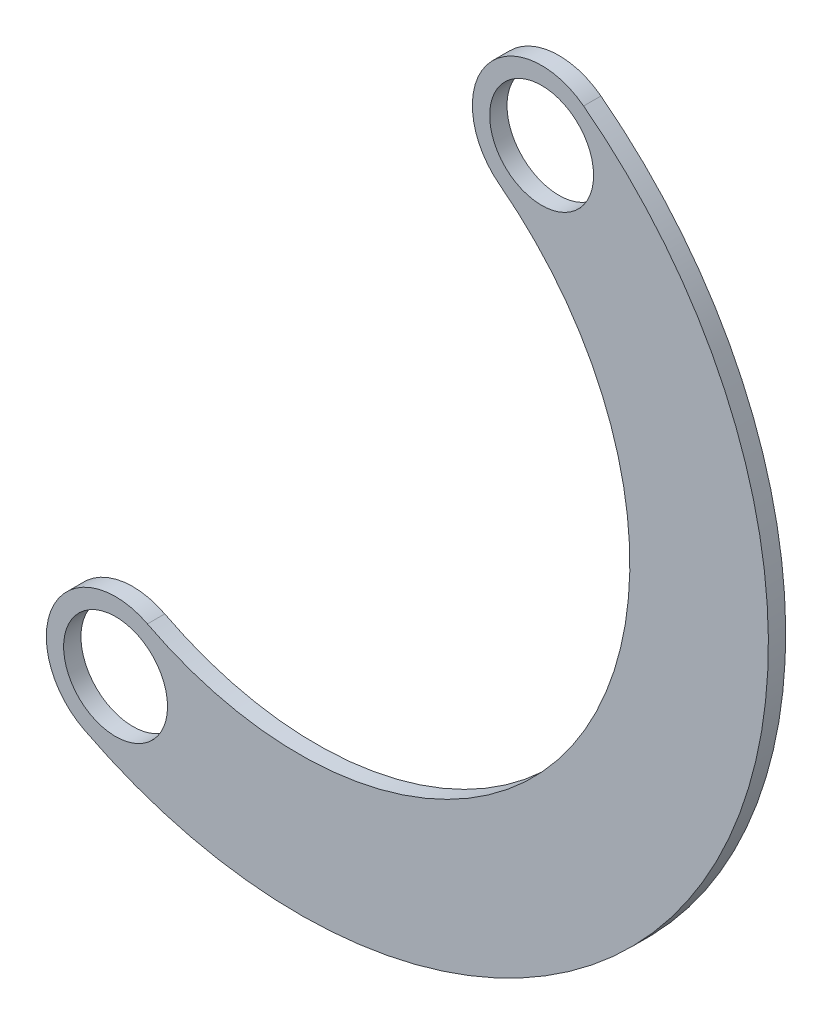
ISO-10303-21;
HEADER;
FILE_DESCRIPTION(('STEP AP214'),'2;1');
FILE_NAME('part.step','',(''),(''),'','','');
FILE_SCHEMA(('AUTOMOTIVE_DESIGN { 1 0 10303 214 1 1 1 1 }'));
ENDSEC;
DATA;
#1=APPLICATION_CONTEXT('core data for automotive mechanical design processes');
#2=APPLICATION_PROTOCOL_DEFINITION('international standard','automotive_design',2000,#1);
#3=PRODUCT_CONTEXT('',#1,'mechanical');
#4=PRODUCT('Part','Part','',(#3));
#5=PRODUCT_RELATED_PRODUCT_CATEGORY('part','',(#4));
#6=PRODUCT_DEFINITION_FORMATION('','',#4);
#7=PRODUCT_DEFINITION_CONTEXT('part definition',#1,'design');
#8=PRODUCT_DEFINITION('design','',#6,#7);
#9=PRODUCT_DEFINITION_SHAPE('','',#8);
#10=(LENGTH_UNIT() NAMED_UNIT(*) SI_UNIT(.MILLI.,.METRE.));
#11=(NAMED_UNIT(*) PLANE_ANGLE_UNIT() SI_UNIT($,.RADIAN.));
#12=(NAMED_UNIT(*) SI_UNIT($,.STERADIAN.) SOLID_ANGLE_UNIT());
#13=UNCERTAINTY_MEASURE_WITH_UNIT(LENGTH_MEASURE(1.E-05),#10,'distance_accuracy_value','');
#14=(GEOMETRIC_REPRESENTATION_CONTEXT(3) GLOBAL_UNCERTAINTY_ASSIGNED_CONTEXT((#13)) GLOBAL_UNIT_ASSIGNED_CONTEXT((#10,
#11,#12)) REPRESENTATION_CONTEXT('',''));
#15=CARTESIAN_POINT('',(0.,0.,0.));
#16=DIRECTION('',(0.,0.,1.));
#17=DIRECTION('',(1.,0.,0.));
#18=AXIS2_PLACEMENT_3D('',#15,#16,#17);
#19=CARTESIAN_POINT('',(-31.74801505549,-33.8701732648816,-1.));
#20=DIRECTION('',(0.,0.,1.));
#21=DIRECTION('',(1.,0.,0.));
#22=AXIS2_PLACEMENT_3D('',#19,#20,#21);
#23=CYLINDRICAL_SURFACE('',#22,4.);
#24=CARTESIAN_POINT('',(-31.74801505549,-33.8701732648816,0.));
#25=DIRECTION('',(0.,0.,1.));
#26=DIRECTION('',(1.,0.,0.));
#27=AXIS2_PLACEMENT_3D('',#24,#25,#26);
#28=CIRCLE('',#27,4.);
#29=CARTESIAN_POINT('',(-29.9093952634183,-30.3177829062355,0.));
#30=VERTEX_POINT('',#29);
#31=CARTESIAN_POINT('',(-33.5866348475618,-37.4225636235277,0.));
#32=VERTEX_POINT('',#31);
#33=EDGE_CURVE('E106',#30,#32,#28,.T.);
#34=ORIENTED_EDGE('',*,*,#33,.F.);
#35=DIRECTION('',(0.,0.,1.));
#36=VECTOR('',#35,1.);
#37=CARTESIAN_POINT('',(-29.9093952634183,-30.3177829062355,-1.));
#38=LINE('',#37,#36);
#39=CARTESIAN_POINT('',(-29.9093952634183,-30.3177829062355,-1.));
#40=VERTEX_POINT('',#39);
#41=EDGE_CURVE('E11',#40,#30,#38,.T.);
#42=ORIENTED_EDGE('',*,*,#41,.F.);
#43=CARTESIAN_POINT('',(-31.74801505549,-33.8701732648816,-1.));
#44=DIRECTION('',(0.,0.,1.));
#45=DIRECTION('',(1.,0.,0.));
#46=AXIS2_PLACEMENT_3D('',#43,#44,#45);
#47=CIRCLE('',#46,4.);
#48=CARTESIAN_POINT('',(-33.5866348475618,-37.4225636235277,-1.));
#49=VERTEX_POINT('',#48);
#50=EDGE_CURVE('E99',#40,#49,#47,.T.);
#51=ORIENTED_EDGE('',*,*,#50,.T.);
#52=DIRECTION('',(0.,0.,1.));
#53=VECTOR('',#52,1.);
#54=CARTESIAN_POINT('',(-33.5866348475618,-37.4225636235277,-1.));
#55=LINE('',#54,#53);
#56=EDGE_CURVE('E44',#49,#32,#55,.T.);
#57=ORIENTED_EDGE('',*,*,#56,.T.);
#58=EDGE_LOOP('',(#34,#42,#51,#57));
#59=FACE_BOUND('',#58,.T.);
#60=ADVANCED_FACE('F41',(#59),#23,.T.);
#61=CARTESIAN_POINT('',(-21.1360565289256,-13.3668482606176,-1.));
#62=DIRECTION('',(0.,0.,1.));
#63=DIRECTION('',(1.,0.,0.));
#64=AXIS2_PLACEMENT_3D('',#61,#62,#63);
#65=CYLINDRICAL_SURFACE('',#64,19.0867927612304);
#66=CARTESIAN_POINT('',(-21.1360565289256,-13.3668482606176,0.));
#67=DIRECTION('',(0.,0.,-1.));
#68=DIRECTION('',(1.,0.,0.));
#69=AXIS2_PLACEMENT_3D('',#66,#67,#68);
#70=CIRCLE('',#69,19.0867927612304);
#71=CARTESIAN_POINT('',(-9.56853528501294,1.81531595209544,0.));
#72=VERTEX_POINT('',#71);
#73=EDGE_CURVE('E101',#72,#30,#70,.T.);
#74=ORIENTED_EDGE('',*,*,#73,.F.);
#75=DIRECTION('',(0.,0.,1.));
#76=VECTOR('',#75,1.);
#77=CARTESIAN_POINT('',(-9.56853528501294,1.81531595209544,-1.));
#78=LINE('',#77,#76);
#79=CARTESIAN_POINT('',(-9.56853528501294,1.81531595209544,-1.));
#80=VERTEX_POINT('',#79);
#81=EDGE_CURVE('E50',#80,#72,#78,.T.);
#82=ORIENTED_EDGE('',*,*,#81,.F.);
#83=CARTESIAN_POINT('',(-21.1360565289256,-13.3668482606176,-1.));
#84=DIRECTION('',(0.,0.,-1.));
#85=DIRECTION('',(1.,0.,0.));
#86=AXIS2_PLACEMENT_3D('',#83,#84,#85);
#87=CIRCLE('',#86,19.0867927612304);
#88=EDGE_CURVE('E96',#80,#40,#87,.T.);
#89=ORIENTED_EDGE('',*,*,#88,.T.);
#90=ORIENTED_EDGE('',*,*,#41,.T.);
#91=EDGE_LOOP('',(#74,#82,#89,#90));
#92=FACE_BOUND('',#91,.T.);
#93=ADVANCED_FACE('F117',(#92),#65,.F.);
#94=CARTESIAN_POINT('',(-7.14434146919093,4.99702686657689,-1.));
#95=DIRECTION('',(0.,0.,1.));
#96=DIRECTION('',(1.,0.,0.));
#97=AXIS2_PLACEMENT_3D('',#94,#95,#96);
#98=CYLINDRICAL_SURFACE('',#97,4.);
#99=CARTESIAN_POINT('',(-7.14434146919093,4.99702686657689,0.));
#100=DIRECTION('',(0.,0.,1.));
#101=DIRECTION('',(1.,0.,0.));
#102=AXIS2_PLACEMENT_3D('',#99,#100,#101);
#103=CIRCLE('',#102,4.);
#104=CARTESIAN_POINT('',(-4.72014765336893,8.17873778105836,0.));
#105=VERTEX_POINT('',#104);
#106=EDGE_CURVE('E91',#105,#72,#103,.T.);
#107=ORIENTED_EDGE('',*,*,#106,.F.);
#108=DIRECTION('',(0.,0.,1.));
#109=VECTOR('',#108,1.);
#110=CARTESIAN_POINT('',(-4.72014765336893,8.17873778105836,-1.));
#111=LINE('',#110,#109);
#112=CARTESIAN_POINT('',(-4.72014765336893,8.17873778105836,-1.));
#113=VERTEX_POINT('',#112);
#114=EDGE_CURVE('E86',#113,#105,#111,.T.);
#115=ORIENTED_EDGE('',*,*,#114,.F.);
#116=CARTESIAN_POINT('',(-7.14434146919093,4.99702686657689,-1.));
#117=DIRECTION('',(0.,0.,1.));
#118=DIRECTION('',(1.,0.,0.));
#119=AXIS2_PLACEMENT_3D('',#116,#117,#118);
#120=CIRCLE('',#119,4.);
#121=EDGE_CURVE('E89',#113,#80,#120,.T.);
#122=ORIENTED_EDGE('',*,*,#121,.T.);
#123=ORIENTED_EDGE('',*,*,#81,.T.);
#124=EDGE_LOOP('',(#107,#115,#122,#123));
#125=FACE_BOUND('',#124,.T.);
#126=ADVANCED_FACE('F88',(#125),#98,.T.);
#127=CARTESIAN_POINT('',(-21.1360565289256,-13.3668482606176,-1.));
#128=DIRECTION('',(0.,0.,1.));
#129=DIRECTION('',(1.,0.,0.));
#130=AXIS2_PLACEMENT_3D('',#127,#128,#129);
#131=CYLINDRICAL_SURFACE('',#130,27.0867927612304);
#132=CARTESIAN_POINT('',(-21.1360565289256,-13.3668482606176,0.));
#133=DIRECTION('',(0.,0.,1.));
#134=DIRECTION('',(1.,0.,0.));
#135=AXIS2_PLACEMENT_3D('',#132,#133,#134);
#136=CIRCLE('',#135,27.0867927612304);
#137=EDGE_CURVE('E109',#32,#105,#136,.T.);
#138=ORIENTED_EDGE('',*,*,#137,.F.);
#139=ORIENTED_EDGE('',*,*,#56,.F.);
#140=CARTESIAN_POINT('',(-21.1360565289256,-13.3668482606176,-1.));
#141=DIRECTION('',(0.,0.,1.));
#142=DIRECTION('',(1.,0.,0.));
#143=AXIS2_PLACEMENT_3D('',#140,#141,#142);
#144=CIRCLE('',#143,27.0867927612304);
#145=EDGE_CURVE('E95',#49,#113,#144,.T.);
#146=ORIENTED_EDGE('',*,*,#145,.T.);
#147=ORIENTED_EDGE('',*,*,#114,.T.);
#148=EDGE_LOOP('',(#138,#139,#146,#147));
#149=FACE_BOUND('',#148,.T.);
#150=ADVANCED_FACE('F98',(#149),#131,.T.);
#151=CARTESIAN_POINT('',(-26.4420357922078,-23.6185107627496,-1.));
#152=DIRECTION('',(0.,0.,1.));
#153=DIRECTION('',(1.,0.,0.));
#154=AXIS2_PLACEMENT_3D('',#151,#152,#153);
#155=PLANE('',#154);
#156=CARTESIAN_POINT('',(-7.14434146919093,4.99702686657689,-1.));
#157=DIRECTION('',(0.,0.,1.));
#158=DIRECTION('',(1.,0.,0.));
#159=AXIS2_PLACEMENT_3D('',#156,#157,#158);
#160=CIRCLE('',#159,3.);
#161=CARTESIAN_POINT('',(-4.14434146919093,4.99702686657689,-1.));
#162=VERTEX_POINT('',#161);
#163=EDGE_CURVE('E150',#162,#162,#160,.T.);
#164=ORIENTED_EDGE('',*,*,#163,.T.);
#165=EDGE_LOOP('',(#164));
#166=FACE_BOUND('',#165,.T.);
#167=CARTESIAN_POINT('',(-31.74801505549,-33.8701732648816,-1.));
#168=DIRECTION('',(0.,0.,1.));
#169=DIRECTION('',(1.,0.,0.));
#170=AXIS2_PLACEMENT_3D('',#167,#168,#169);
#171=CIRCLE('',#170,3.);
#172=CARTESIAN_POINT('',(-28.74801505549,-33.8701732648816,-1.));
#173=VERTEX_POINT('',#172);
#174=EDGE_CURVE('E110',#173,#173,#171,.T.);
#175=ORIENTED_EDGE('',*,*,#174,.T.);
#176=EDGE_LOOP('',(#175));
#177=FACE_BOUND('',#176,.T.);
#178=ORIENTED_EDGE('',*,*,#50,.F.);
#179=ORIENTED_EDGE('',*,*,#88,.F.);
#180=ORIENTED_EDGE('',*,*,#121,.F.);
#181=ORIENTED_EDGE('',*,*,#145,.F.);
#182=EDGE_LOOP('',(#178,#179,#180,#181));
#183=FACE_BOUND('',#182,.T.);
#184=ADVANCED_FACE('F94',(#166,#177,#183),#155,.F.);
#185=CARTESIAN_POINT('',(-26.4420357922078,-23.6185107627496,0.));
#186=DIRECTION('',(0.,0.,1.));
#187=DIRECTION('',(1.,0.,0.));
#188=AXIS2_PLACEMENT_3D('',#185,#186,#187);
#189=PLANE('',#188);
#190=CARTESIAN_POINT('',(-7.14434146919093,4.99702686657689,0.));
#191=DIRECTION('',(0.,0.,1.));
#192=DIRECTION('',(1.,0.,0.));
#193=AXIS2_PLACEMENT_3D('',#190,#191,#192);
#194=CIRCLE('',#193,3.);
#195=CARTESIAN_POINT('',(-4.14434146919093,4.99702686657689,0.));
#196=VERTEX_POINT('',#195);
#197=EDGE_CURVE('E153',#196,#196,#194,.T.);
#198=ORIENTED_EDGE('',*,*,#197,.F.);
#199=EDGE_LOOP('',(#198));
#200=FACE_BOUND('',#199,.T.);
#201=CARTESIAN_POINT('',(-31.74801505549,-33.8701732648816,0.));
#202=DIRECTION('',(0.,0.,1.));
#203=DIRECTION('',(1.,0.,0.));
#204=AXIS2_PLACEMENT_3D('',#201,#202,#203);
#205=CIRCLE('',#204,3.);
#206=CARTESIAN_POINT('',(-28.74801505549,-33.8701732648816,0.));
#207=VERTEX_POINT('',#206);
#208=EDGE_CURVE('E155',#207,#207,#205,.T.);
#209=ORIENTED_EDGE('',*,*,#208,.F.);
#210=EDGE_LOOP('',(#209));
#211=FACE_BOUND('',#210,.T.);
#212=ORIENTED_EDGE('',*,*,#33,.T.);
#213=ORIENTED_EDGE('',*,*,#137,.T.);
#214=ORIENTED_EDGE('',*,*,#106,.T.);
#215=ORIENTED_EDGE('',*,*,#73,.T.);
#216=EDGE_LOOP('',(#212,#213,#214,#215));
#217=FACE_BOUND('',#216,.T.);
#218=ADVANCED_FACE('F116',(#200,#211,#217),#189,.T.);
#219=CARTESIAN_POINT('',(-31.74801505549,-33.8701732648816,-1.));
#220=DIRECTION('',(0.,0.,1.));
#221=DIRECTION('',(1.,0.,0.));
#222=AXIS2_PLACEMENT_3D('',#219,#220,#221);
#223=CYLINDRICAL_SURFACE('',#222,3.);
#224=ORIENTED_EDGE('',*,*,#174,.F.);
#225=EDGE_LOOP('',(#224));
#226=FACE_BOUND('',#225,.T.);
#227=ORIENTED_EDGE('',*,*,#208,.T.);
#228=EDGE_LOOP('',(#227));
#229=FACE_BOUND('',#228,.T.);
#230=ADVANCED_FACE('F135',(#226,#229),#223,.F.);
#231=CARTESIAN_POINT('',(-7.14434146919093,4.99702686657689,-1.));
#232=DIRECTION('',(0.,0.,1.));
#233=DIRECTION('',(1.,0.,0.));
#234=AXIS2_PLACEMENT_3D('',#231,#232,#233);
#235=CYLINDRICAL_SURFACE('',#234,3.);
#236=ORIENTED_EDGE('',*,*,#163,.F.);
#237=EDGE_LOOP('',(#236));
#238=FACE_BOUND('',#237,.T.);
#239=ORIENTED_EDGE('',*,*,#197,.T.);
#240=EDGE_LOOP('',(#239));
#241=FACE_BOUND('',#240,.T.);
#242=ADVANCED_FACE('F142',(#238,#241),#235,.F.);
#243=CLOSED_SHELL('',(#60,#93,#126,#150,#184,#218,#230,#242));
#244=MANIFOLD_SOLID_BREP('B2',#243);
#245=ADVANCED_BREP_SHAPE_REPRESENTATION('',(#18,#244),#14);
#246=SHAPE_DEFINITION_REPRESENTATION(#9,#245);
ENDSEC;
END-ISO-10303-21;
